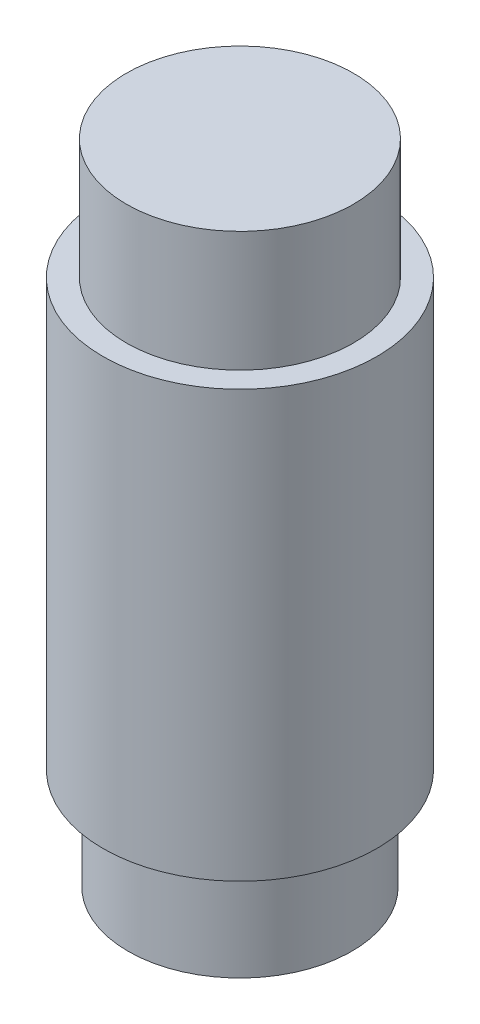
ISO-10303-21;
HEADER;
FILE_DESCRIPTION(('STEP AP214'),'2;1');
FILE_NAME('part.step','',(''),(''),'','','');
FILE_SCHEMA(('AUTOMOTIVE_DESIGN { 1 0 10303 214 1 1 1 1 }'));
ENDSEC;
DATA;
#1=APPLICATION_CONTEXT('core data for automotive mechanical design processes');
#2=APPLICATION_PROTOCOL_DEFINITION('international standard','automotive_design',2000,#1);
#3=PRODUCT_CONTEXT('',#1,'mechanical');
#4=PRODUCT('Part','Part','',(#3));
#5=PRODUCT_RELATED_PRODUCT_CATEGORY('part','',(#4));
#6=PRODUCT_DEFINITION_FORMATION('','',#4);
#7=PRODUCT_DEFINITION_CONTEXT('part definition',#1,'design');
#8=PRODUCT_DEFINITION('design','',#6,#7);
#9=PRODUCT_DEFINITION_SHAPE('','',#8);
#10=(LENGTH_UNIT() NAMED_UNIT(*) SI_UNIT(.MILLI.,.METRE.));
#11=(NAMED_UNIT(*) PLANE_ANGLE_UNIT() SI_UNIT($,.RADIAN.));
#12=(NAMED_UNIT(*) SI_UNIT($,.STERADIAN.) SOLID_ANGLE_UNIT());
#13=UNCERTAINTY_MEASURE_WITH_UNIT(LENGTH_MEASURE(1.E-05),#10,'distance_accuracy_value','');
#14=(GEOMETRIC_REPRESENTATION_CONTEXT(3) GLOBAL_UNCERTAINTY_ASSIGNED_CONTEXT((#13)) GLOBAL_UNIT_ASSIGNED_CONTEXT((#10,
#11,#12)) REPRESENTATION_CONTEXT('',''));
#15=CARTESIAN_POINT('',(0.,0.,0.));
#16=DIRECTION('',(0.,0.,1.));
#17=DIRECTION('',(1.,0.,0.));
#18=AXIS2_PLACEMENT_3D('',#15,#16,#17);
#19=CARTESIAN_POINT('',(0.,31.9,0.));
#20=DIRECTION('',(0.,-1.,0.));
#21=DIRECTION('',(0.,0.,-1.));
#22=AXIS2_PLACEMENT_3D('',#19,#20,#21);
#23=CYLINDRICAL_SURFACE('',#22,10.25);
#24=CARTESIAN_POINT('',(0.,31.9,0.));
#25=DIRECTION('',(0.,1.,0.));
#26=DIRECTION('',(0.,0.,1.));
#27=AXIS2_PLACEMENT_3D('',#24,#25,#26);
#28=CIRCLE('',#27,10.25);
#29=CARTESIAN_POINT('',(0.,31.9,10.25));
#30=VERTEX_POINT('',#29);
#31=EDGE_CURVE('E54',#30,#30,#28,.T.);
#32=ORIENTED_EDGE('',*,*,#31,.F.);
#33=EDGE_LOOP('',(#32));
#34=FACE_BOUND('',#33,.T.);
#35=CARTESIAN_POINT('',(0.,0.,0.));
#36=DIRECTION('',(0.,1.,0.));
#37=DIRECTION('',(0.,0.,1.));
#38=AXIS2_PLACEMENT_3D('',#35,#36,#37);
#39=CIRCLE('',#38,10.25);
#40=CARTESIAN_POINT('',(0.,0.,10.25));
#41=VERTEX_POINT('',#40);
#42=EDGE_CURVE('E43',#41,#41,#39,.T.);
#43=ORIENTED_EDGE('',*,*,#42,.T.);
#44=EDGE_LOOP('',(#43));
#45=FACE_BOUND('',#44,.T.);
#46=ADVANCED_FACE('F40',(#34,#45),#23,.T.);
#47=CARTESIAN_POINT('',(0.,31.9,0.));
#48=DIRECTION('',(0.,1.,0.));
#49=DIRECTION('',(0.,0.,1.));
#50=AXIS2_PLACEMENT_3D('',#47,#48,#49);
#51=PLANE('',#50);
#52=CARTESIAN_POINT('',(0.,31.9,0.));
#53=DIRECTION('',(0.,1.,0.));
#54=DIRECTION('',(0.,0.,1.));
#55=AXIS2_PLACEMENT_3D('',#52,#53,#54);
#56=CIRCLE('',#55,8.5);
#57=CARTESIAN_POINT('',(0.,31.9,8.5));
#58=VERTEX_POINT('',#57);
#59=EDGE_CURVE('E48',#58,#58,#56,.T.);
#60=ORIENTED_EDGE('',*,*,#59,.F.);
#61=EDGE_LOOP('',(#60));
#62=FACE_BOUND('',#61,.T.);
#63=ORIENTED_EDGE('',*,*,#31,.T.);
#64=EDGE_LOOP('',(#63));
#65=FACE_BOUND('',#64,.T.);
#66=ADVANCED_FACE('F91',(#62,#65),#51,.T.);
#67=CARTESIAN_POINT('',(0.,0.,0.));
#68=DIRECTION('',(0.,1.,0.));
#69=DIRECTION('',(0.,0.,1.));
#70=AXIS2_PLACEMENT_3D('',#67,#68,#69);
#71=PLANE('',#70);
#72=CARTESIAN_POINT('',(0.,0.,0.));
#73=DIRECTION('',(0.,-1.,0.));
#74=DIRECTION('',(0.,0.,-1.));
#75=AXIS2_PLACEMENT_3D('',#72,#73,#74);
#76=CIRCLE('',#75,8.375);
#77=CARTESIAN_POINT('',(0.,0.,8.375));
#78=VERTEX_POINT('',#77);
#79=EDGE_CURVE('E10',#78,#78,#76,.T.);
#80=ORIENTED_EDGE('',*,*,#79,.F.);
#81=EDGE_LOOP('',(#80));
#82=FACE_BOUND('',#81,.T.);
#83=ORIENTED_EDGE('',*,*,#42,.F.);
#84=EDGE_LOOP('',(#83));
#85=FACE_BOUND('',#84,.T.);
#86=ADVANCED_FACE('F81',(#82,#85),#71,.F.);
#87=CARTESIAN_POINT('',(0.,35.9,0.));
#88=DIRECTION('',(0.,-1.,0.));
#89=DIRECTION('',(0.,0.,-1.));
#90=AXIS2_PLACEMENT_3D('',#87,#88,#89);
#91=CYLINDRICAL_SURFACE('',#90,8.5);
#92=ORIENTED_EDGE('',*,*,#59,.T.);
#93=EDGE_LOOP('',(#92));
#94=FACE_BOUND('',#93,.T.);
#95=CARTESIAN_POINT('',(0.,40.9,0.));
#96=DIRECTION('',(0.,1.,0.));
#97=DIRECTION('',(0.,0.,1.));
#98=AXIS2_PLACEMENT_3D('',#95,#96,#97);
#99=CIRCLE('',#98,8.5);
#100=CARTESIAN_POINT('',(0.,40.9,8.5));
#101=VERTEX_POINT('',#100);
#102=EDGE_CURVE('E69',#101,#101,#99,.T.);
#103=ORIENTED_EDGE('',*,*,#102,.F.);
#104=EDGE_LOOP('',(#103));
#105=FACE_BOUND('',#104,.T.);
#106=ADVANCED_FACE('F78',(#94,#105),#91,.T.);
#107=CARTESIAN_POINT('',(0.,-7.6,0.));
#108=DIRECTION('',(0.,1.,0.));
#109=DIRECTION('',(0.,0.,1.));
#110=AXIS2_PLACEMENT_3D('',#107,#108,#109);
#111=CYLINDRICAL_SURFACE('',#110,8.375);
#112=CARTESIAN_POINT('',(0.,-7.6,0.));
#113=DIRECTION('',(0.,-1.,0.));
#114=DIRECTION('',(0.,0.,-1.));
#115=AXIS2_PLACEMENT_3D('',#112,#113,#114);
#116=CIRCLE('',#115,8.375);
#117=CARTESIAN_POINT('',(0.,-7.6,8.375));
#118=VERTEX_POINT('',#117);
#119=EDGE_CURVE('E57',#118,#118,#116,.T.);
#120=CARTESIAN_POINT('',(0.,-7.6,8.375));
#121=CARTESIAN_POINT('',(0.,-7.52083333333333,8.375));
#122=CARTESIAN_POINT('',(0.,-7.44166666666667,8.375));
#123=CARTESIAN_POINT('',(0.,-7.28333333333333,8.375));
#124=CARTESIAN_POINT('',(0.,-7.20416666666667,8.375));
#125=CARTESIAN_POINT('',(0.,-7.04583333333333,8.375));
#126=CARTESIAN_POINT('',(0.,-6.96666666666667,8.375));
#127=CARTESIAN_POINT('',(0.,-6.80833333333333,8.375));
#128=CARTESIAN_POINT('',(0.,-6.72916666666667,8.375));
#129=CARTESIAN_POINT('',(0.,-6.57083333333333,8.375));
#130=CARTESIAN_POINT('',(0.,-6.49166666666667,8.375));
#131=CARTESIAN_POINT('',(0.,-6.33333333333333,8.375));
#132=CARTESIAN_POINT('',(0.,-6.25416666666667,8.375));
#133=CARTESIAN_POINT('',(0.,-6.09583333333333,8.375));
#134=CARTESIAN_POINT('',(0.,-6.01666666666667,8.375));
#135=CARTESIAN_POINT('',(0.,-5.85833333333333,8.375));
#136=CARTESIAN_POINT('',(0.,-5.77916666666667,8.375));
#137=CARTESIAN_POINT('',(0.,-5.62083333333333,8.375));
#138=CARTESIAN_POINT('',(0.,-5.54166666666667,8.375));
#139=CARTESIAN_POINT('',(0.,-5.38333333333333,8.375));
#140=CARTESIAN_POINT('',(0.,-5.30416666666667,8.375));
#141=CARTESIAN_POINT('',(0.,-5.14583333333333,8.375));
#142=CARTESIAN_POINT('',(0.,-5.06666666666667,8.375));
#143=CARTESIAN_POINT('',(0.,-4.90833333333333,8.375));
#144=CARTESIAN_POINT('',(0.,-4.82916666666667,8.375));
#145=CARTESIAN_POINT('',(0.,-4.67083333333333,8.375));
#146=CARTESIAN_POINT('',(0.,-4.59166666666667,8.375));
#147=CARTESIAN_POINT('',(0.,-4.43333333333333,8.375));
#148=CARTESIAN_POINT('',(0.,-4.35416666666667,8.375));
#149=CARTESIAN_POINT('',(0.,-4.19583333333333,8.375));
#150=CARTESIAN_POINT('',(0.,-4.11666666666667,8.375));
#151=CARTESIAN_POINT('',(0.,-3.95833333333333,8.375));
#152=CARTESIAN_POINT('',(0.,-3.87916666666667,8.375));
#153=CARTESIAN_POINT('',(0.,-3.72083333333333,8.375));
#154=CARTESIAN_POINT('',(0.,-3.64166666666667,8.375));
#155=CARTESIAN_POINT('',(0.,-3.48333333333333,8.375));
#156=CARTESIAN_POINT('',(0.,-3.40416666666667,8.375));
#157=CARTESIAN_POINT('',(0.,-3.24583333333333,8.375));
#158=CARTESIAN_POINT('',(0.,-3.16666666666667,8.375));
#159=CARTESIAN_POINT('',(0.,-3.00833333333333,8.375));
#160=CARTESIAN_POINT('',(0.,-2.92916666666667,8.375));
#161=CARTESIAN_POINT('',(0.,-2.77083333333333,8.375));
#162=CARTESIAN_POINT('',(0.,-2.69166666666667,8.375));
#163=CARTESIAN_POINT('',(0.,-2.53333333333333,8.375));
#164=CARTESIAN_POINT('',(0.,-2.45416666666667,8.375));
#165=CARTESIAN_POINT('',(0.,-2.29583333333333,8.375));
#166=CARTESIAN_POINT('',(0.,-2.21666666666667,8.375));
#167=CARTESIAN_POINT('',(0.,-2.05833333333333,8.375));
#168=CARTESIAN_POINT('',(0.,-1.97916666666667,8.375));
#169=CARTESIAN_POINT('',(0.,-1.82083333333333,8.375));
#170=CARTESIAN_POINT('',(0.,-1.74166666666667,8.375));
#171=CARTESIAN_POINT('',(0.,-1.58333333333333,8.375));
#172=CARTESIAN_POINT('',(0.,-1.50416666666667,8.375));
#173=CARTESIAN_POINT('',(0.,-1.34583333333333,8.375));
#174=CARTESIAN_POINT('',(0.,-1.26666666666667,8.375));
#175=CARTESIAN_POINT('',(0.,-1.10833333333333,8.375));
#176=CARTESIAN_POINT('',(0.,-1.02916666666667,8.375));
#177=CARTESIAN_POINT('',(0.,-0.870833333333333,8.375));
#178=CARTESIAN_POINT('',(0.,-0.791666666666667,8.375));
#179=CARTESIAN_POINT('',(0.,-0.633333333333333,8.375));
#180=CARTESIAN_POINT('',(0.,-0.554166666666666,8.375));
#181=CARTESIAN_POINT('',(0.,-0.395833333333333,8.375));
#182=CARTESIAN_POINT('',(0.,-0.316666666666667,8.375));
#183=CARTESIAN_POINT('',(0.,-0.158333333333333,8.375));
#184=CARTESIAN_POINT('',(0.,-0.0791666666666665,8.375));
#185=CARTESIAN_POINT('',(0.,0.,8.375));
#186=B_SPLINE_CURVE_WITH_KNOTS('',3,(#120,#121,#122,#123,#124,#125,#126,#127,#128,#129,#130,
#131,#132,#133,#134,#135,#136,#137,#138,#139,#140,#141,#142,#143,#144,#145,#146,#147,#148,#149,
#150,#151,#152,#153,#154,#155,#156,#157,#158,#159,#160,#161,#162,#163,#164,#165,#166,#167,#168,
#169,#170,#171,#172,#173,#174,#175,#176,#177,#178,#179,#180,#181,#182,#183,#184,#185),
.UNSPECIFIED.,.F.,.F.,(4,2,2,2,2,2,2,2,2,2,2,2,2,2,2,2,2,2,2,2,2,2,2,2,2,2,2,2,2,2,2,2,4),(0.,
0.2375,0.475,0.7125,0.95,1.1875,1.425,1.6625,1.9,2.1375,2.375,2.6125,2.85,3.0875,3.325,3.5625,
3.8,4.0375,4.275,4.5125,4.75,4.9875,5.225,5.4625,5.7,5.9375,6.175,6.4125,6.65,6.8875,7.125,
7.3625,7.6),.UNSPECIFIED.);
#187=EDGE_CURVE('BSEAM80',#118,#78,#186,.T.);
#188=ORIENTED_EDGE('',*,*,#119,.F.);
#189=ORIENTED_EDGE('',*,*,#79,.T.);
#190=ORIENTED_EDGE('',*,*,#187,.T.);
#191=ORIENTED_EDGE('',*,*,#187,.F.);
#192=EDGE_LOOP('',(#188,#190,#189,#191));
#193=FACE_BOUND('',#192,.T.);
#194=ADVANCED_FACE('F80',(#193),#111,.T.);
#195=CARTESIAN_POINT('',(0.,-7.6,0.));
#196=DIRECTION('',(0.,-1.,0.));
#197=DIRECTION('',(0.,0.,-1.));
#198=AXIS2_PLACEMENT_3D('',#195,#196,#197);
#199=PLANE('',#198);
#200=ORIENTED_EDGE('',*,*,#119,.T.);
#201=EDGE_LOOP('',(#200));
#202=FACE_BOUND('',#201,.T.);
#203=ADVANCED_FACE('F88',(#202),#199,.T.);
#204=CARTESIAN_POINT('',(0.,40.9,0.));
#205=DIRECTION('',(0.,1.,0.));
#206=DIRECTION('',(0.,0.,1.));
#207=AXIS2_PLACEMENT_3D('',#204,#205,#206);
#208=PLANE('',#207);
#209=ORIENTED_EDGE('',*,*,#102,.T.);
#210=EDGE_LOOP('',(#209));
#211=FACE_BOUND('',#210,.T.);
#212=ADVANCED_FACE('F76',(#211),#208,.T.);
#213=CLOSED_SHELL('',(#46,#66,#86,#106,#194,#203,#212));
#214=MANIFOLD_SOLID_BREP('B2',#213);
#215=ADVANCED_BREP_SHAPE_REPRESENTATION('',(#18,#214),#14);
#216=SHAPE_DEFINITION_REPRESENTATION(#9,#215);
ENDSEC;
END-ISO-10303-21;
